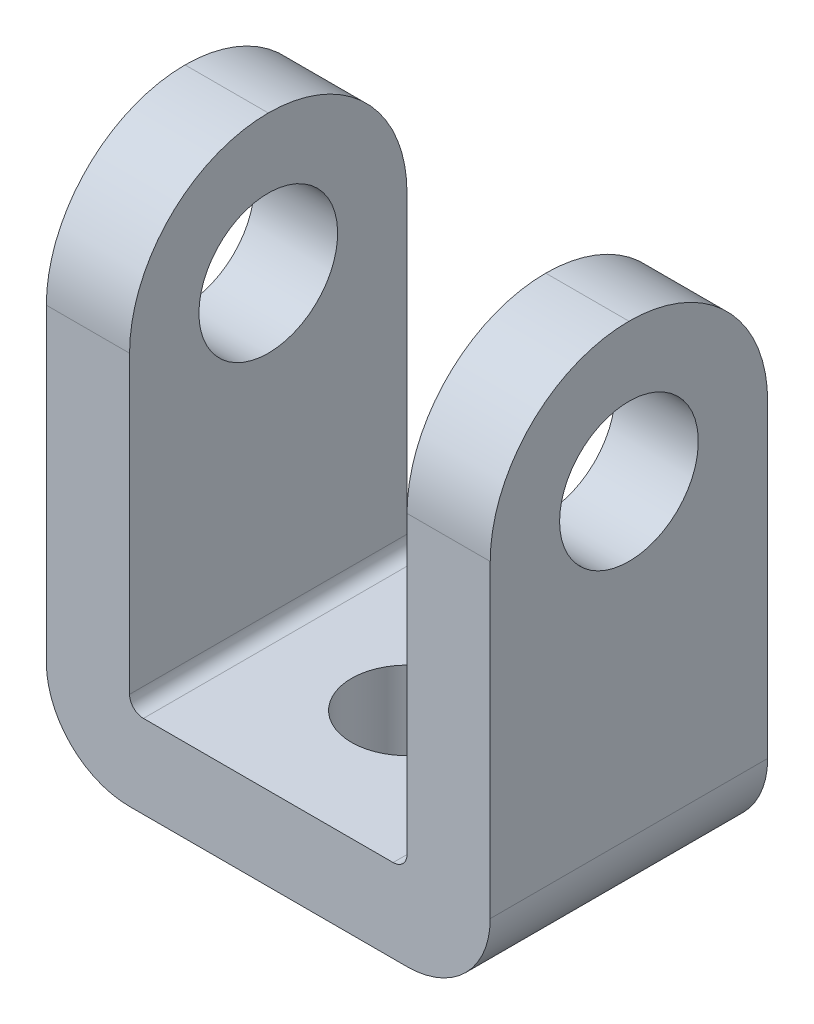
ISO-10303-21;
HEADER;
FILE_DESCRIPTION(('STEP AP214'),'2;1');
FILE_NAME('part.step','',(''),(''),'','','');
FILE_SCHEMA(('AUTOMOTIVE_DESIGN { 1 0 10303 214 1 1 1 1 }'));
ENDSEC;
DATA;
#1=APPLICATION_CONTEXT('core data for automotive mechanical design processes');
#2=APPLICATION_PROTOCOL_DEFINITION('international standard','automotive_design',2000,#1);
#3=PRODUCT_CONTEXT('',#1,'mechanical');
#4=PRODUCT('Part','Part','',(#3));
#5=PRODUCT_RELATED_PRODUCT_CATEGORY('part','',(#4));
#6=PRODUCT_DEFINITION_FORMATION('','',#4);
#7=PRODUCT_DEFINITION_CONTEXT('part definition',#1,'design');
#8=PRODUCT_DEFINITION('design','',#6,#7);
#9=PRODUCT_DEFINITION_SHAPE('','',#8);
#10=(LENGTH_UNIT() NAMED_UNIT(*) SI_UNIT(.MILLI.,.METRE.));
#11=(NAMED_UNIT(*) PLANE_ANGLE_UNIT() SI_UNIT($,.RADIAN.));
#12=(NAMED_UNIT(*) SI_UNIT($,.STERADIAN.) SOLID_ANGLE_UNIT());
#13=UNCERTAINTY_MEASURE_WITH_UNIT(LENGTH_MEASURE(1.E-05),#10,'distance_accuracy_value','');
#14=(GEOMETRIC_REPRESENTATION_CONTEXT(3) GLOBAL_UNCERTAINTY_ASSIGNED_CONTEXT((#13)) GLOBAL_UNIT_ASSIGNED_CONTEXT((#10,
#11,#12)) REPRESENTATION_CONTEXT('',''));
#15=CARTESIAN_POINT('',(0.,0.,0.));
#16=DIRECTION('',(0.,0.,1.));
#17=DIRECTION('',(1.,0.,0.));
#18=AXIS2_PLACEMENT_3D('',#15,#16,#17);
#19=CARTESIAN_POINT('',(0.,0.,10.));
#20=DIRECTION('',(1.,0.,0.));
#21=DIRECTION('',(0.,0.,-1.));
#22=AXIS2_PLACEMENT_3D('',#19,#20,#21);
#23=PLANE('',#22);
#24=CARTESIAN_POINT('',(0.,-5.,5.));
#25=DIRECTION('',(-1.,0.,0.));
#26=DIRECTION('',(0.,0.,1.));
#27=AXIS2_PLACEMENT_3D('',#24,#25,#26);
#28=CIRCLE('',#27,2.5);
#29=CARTESIAN_POINT('',(0.,-5.,7.5));
#30=VERTEX_POINT('',#29);
#31=EDGE_CURVE('E513',#30,#30,#28,.T.);
#32=ORIENTED_EDGE('',*,*,#31,.F.);
#33=EDGE_LOOP('',(#32));
#34=FACE_BOUND('',#33,.T.);
#35=DIRECTION('',(0.,-1.,0.));
#36=VECTOR('',#35,1.);
#37=CARTESIAN_POINT('',(0.,0.,0.));
#38=LINE('',#37,#36);
#39=CARTESIAN_POINT('',(0.,-5.,0.));
#40=VERTEX_POINT('',#39);
#41=CARTESIAN_POINT('',(0.,-16.1484375,0.));
#42=VERTEX_POINT('',#41);
#43=EDGE_CURVE('E262',#40,#42,#38,.T.);
#44=ORIENTED_EDGE('',*,*,#43,.T.);
#45=DIRECTION('',(0.,0.,-1.));
#46=VECTOR('',#45,1.);
#47=CARTESIAN_POINT('',(0.,-16.1484375,10.));
#48=LINE('',#47,#46);
#49=CARTESIAN_POINT('',(0.,-16.1484375,10.));
#50=VERTEX_POINT('',#49);
#51=EDGE_CURVE('E158',#42,#50,#48,.F.);
#52=ORIENTED_EDGE('',*,*,#51,.T.);
#53=DIRECTION('',(0.,-1.,0.));
#54=VECTOR('',#53,1.);
#55=CARTESIAN_POINT('',(0.,0.,10.));
#56=LINE('',#55,#54);
#57=CARTESIAN_POINT('',(0.,-5.,10.));
#58=VERTEX_POINT('',#57);
#59=EDGE_CURVE('E143',#58,#50,#56,.T.);
#60=ORIENTED_EDGE('',*,*,#59,.F.);
#61=CARTESIAN_POINT('',(0.,-5.,5.));
#62=DIRECTION('',(1.,0.,0.));
#63=DIRECTION('',(0.,0.,-1.));
#64=AXIS2_PLACEMENT_3D('',#61,#62,#63);
#65=CIRCLE('',#64,5.);
#66=CARTESIAN_POINT('',(0.,0.,5.));
#67=VERTEX_POINT('',#66);
#68=EDGE_CURVE('E155',#58,#67,#65,.F.);
#69=ORIENTED_EDGE('',*,*,#68,.T.);
#70=CARTESIAN_POINT('',(0.,-5.,5.));
#71=DIRECTION('',(1.,0.,0.));
#72=DIRECTION('',(0.,0.,-1.));
#73=AXIS2_PLACEMENT_3D('',#70,#71,#72);
#74=CIRCLE('',#73,5.);
#75=EDGE_CURVE('E168',#67,#40,#74,.F.);
#76=ORIENTED_EDGE('',*,*,#75,.T.);
#77=EDGE_LOOP('',(#44,#52,#60,#69,#76));
#78=FACE_BOUND('',#77,.T.);
#79=ADVANCED_FACE('F39',(#34,#78),#23,.F.);
#80=CARTESIAN_POINT('',(0.,-19.1484375,10.));
#81=DIRECTION('',(0.,1.,0.));
#82=DIRECTION('',(0.,0.,1.));
#83=AXIS2_PLACEMENT_3D('',#80,#81,#82);
#84=PLANE('',#83);
#85=CARTESIAN_POINT('',(8.,-19.1484375,5.));
#86=DIRECTION('',(0.,1.,0.));
#87=DIRECTION('',(0.,0.,1.));
#88=AXIS2_PLACEMENT_3D('',#85,#86,#87);
#89=CIRCLE('',#88,2.);
#90=CARTESIAN_POINT('',(8.,-19.1484375,7.));
#91=VERTEX_POINT('',#90);
#92=EDGE_CURVE('E511',#91,#91,#89,.F.);
#93=ORIENTED_EDGE('',*,*,#92,.F.);
#94=EDGE_LOOP('',(#93));
#95=FACE_BOUND('',#94,.T.);
#96=DIRECTION('',(1.,0.,0.));
#97=VECTOR('',#96,1.);
#98=CARTESIAN_POINT('',(0.,-19.1484375,0.));
#99=LINE('',#98,#97);
#100=CARTESIAN_POINT('',(3.,-19.1484375,0.));
#101=VERTEX_POINT('',#100);
#102=CARTESIAN_POINT('',(13.,-19.1484375,0.));
#103=VERTEX_POINT('',#102);
#104=EDGE_CURVE('E265',#101,#103,#99,.T.);
#105=ORIENTED_EDGE('',*,*,#104,.T.);
#106=DIRECTION('',(0.,0.,-1.));
#107=VECTOR('',#106,1.);
#108=CARTESIAN_POINT('',(13.,-19.1484375,10.));
#109=LINE('',#108,#107);
#110=CARTESIAN_POINT('',(13.,-19.1484375,10.));
#111=VERTEX_POINT('',#110);
#112=EDGE_CURVE('E206',#103,#111,#109,.F.);
#113=ORIENTED_EDGE('',*,*,#112,.T.);
#114=DIRECTION('',(1.,0.,0.));
#115=VECTOR('',#114,1.);
#116=CARTESIAN_POINT('',(0.,-19.1484375,10.));
#117=LINE('',#116,#115);
#118=CARTESIAN_POINT('',(3.,-19.1484375,10.));
#119=VERTEX_POINT('',#118);
#120=EDGE_CURVE('E160',#119,#111,#117,.T.);
#121=ORIENTED_EDGE('',*,*,#120,.F.);
#122=DIRECTION('',(0.,0.,-1.));
#123=VECTOR('',#122,1.);
#124=CARTESIAN_POINT('',(3.,-19.1484375,10.));
#125=LINE('',#124,#123);
#126=EDGE_CURVE('E202',#119,#101,#125,.T.);
#127=ORIENTED_EDGE('',*,*,#126,.T.);
#128=EDGE_LOOP('',(#105,#113,#121,#127));
#129=FACE_BOUND('',#128,.T.);
#130=ADVANCED_FACE('F309',(#95,#129),#84,.F.);
#131=CARTESIAN_POINT('',(16.,0.,10.));
#132=DIRECTION('',(-1.,0.,0.));
#133=DIRECTION('',(0.,-1.,0.));
#134=AXIS2_PLACEMENT_3D('',#131,#132,#133);
#135=PLANE('',#134);
#136=CARTESIAN_POINT('',(16.,-5.,5.));
#137=DIRECTION('',(-1.,0.,0.));
#138=DIRECTION('',(0.,0.,1.));
#139=AXIS2_PLACEMENT_3D('',#136,#137,#138);
#140=CIRCLE('',#139,2.5);
#141=CARTESIAN_POINT('',(16.,-5.,7.5));
#142=VERTEX_POINT('',#141);
#143=EDGE_CURVE('E281',#142,#142,#140,.T.);
#144=ORIENTED_EDGE('',*,*,#143,.T.);
#145=EDGE_LOOP('',(#144));
#146=FACE_BOUND('',#145,.T.);
#147=DIRECTION('',(0.,1.,0.));
#148=VECTOR('',#147,1.);
#149=CARTESIAN_POINT('',(16.,0.,10.));
#150=LINE('',#149,#148);
#151=CARTESIAN_POINT('',(16.,-16.1484375,10.));
#152=VERTEX_POINT('',#151);
#153=CARTESIAN_POINT('',(16.,-5.,10.));
#154=VERTEX_POINT('',#153);
#155=EDGE_CURVE('E313',#152,#154,#150,.T.);
#156=ORIENTED_EDGE('',*,*,#155,.F.);
#157=DIRECTION('',(0.,0.,-1.));
#158=VECTOR('',#157,1.);
#159=CARTESIAN_POINT('',(16.,-16.1484375,10.));
#160=LINE('',#159,#158);
#161=CARTESIAN_POINT('',(16.,-16.1484375,0.));
#162=VERTEX_POINT('',#161);
#163=EDGE_CURVE('E185',#152,#162,#160,.T.);
#164=ORIENTED_EDGE('',*,*,#163,.T.);
#165=DIRECTION('',(0.,1.,0.));
#166=VECTOR('',#165,1.);
#167=CARTESIAN_POINT('',(16.,0.,0.));
#168=LINE('',#167,#166);
#169=CARTESIAN_POINT('',(16.,-5.,0.));
#170=VERTEX_POINT('',#169);
#171=EDGE_CURVE('E270',#162,#170,#168,.T.);
#172=ORIENTED_EDGE('',*,*,#171,.T.);
#173=CARTESIAN_POINT('',(16.,-5.,5.));
#174=DIRECTION('',(-1.,0.,0.));
#175=DIRECTION('',(0.,-1.,0.));
#176=AXIS2_PLACEMENT_3D('',#173,#174,#175);
#177=CIRCLE('',#176,5.);
#178=CARTESIAN_POINT('',(16.,0.,5.));
#179=VERTEX_POINT('',#178);
#180=EDGE_CURVE('E292',#170,#179,#177,.F.);
#181=ORIENTED_EDGE('',*,*,#180,.T.);
#182=CARTESIAN_POINT('',(16.,-5.,5.));
#183=DIRECTION('',(-1.,0.,0.));
#184=DIRECTION('',(0.,-1.,0.));
#185=AXIS2_PLACEMENT_3D('',#182,#183,#184);
#186=CIRCLE('',#185,5.);
#187=EDGE_CURVE('E295',#179,#154,#186,.F.);
#188=ORIENTED_EDGE('',*,*,#187,.T.);
#189=EDGE_LOOP('',(#156,#164,#172,#181,#188));
#190=FACE_BOUND('',#189,.T.);
#191=ADVANCED_FACE('F340',(#146,#190),#135,.F.);
#192=CARTESIAN_POINT('',(13.,0.,10.));
#193=DIRECTION('',(1.,0.,0.));
#194=DIRECTION('',(0.,1.,0.));
#195=AXIS2_PLACEMENT_3D('',#192,#193,#194);
#196=PLANE('',#195);
#197=CARTESIAN_POINT('',(13.,-5.,5.));
#198=DIRECTION('',(1.,0.,0.));
#199=DIRECTION('',(0.,1.,0.));
#200=AXIS2_PLACEMENT_3D('',#197,#198,#199);
#201=CIRCLE('',#200,2.5);
#202=CARTESIAN_POINT('',(13.,-2.5,5.));
#203=VERTEX_POINT('',#202);
#204=EDGE_CURVE('E266',#203,#203,#201,.T.);
#205=ORIENTED_EDGE('',*,*,#204,.T.);
#206=EDGE_LOOP('',(#205));
#207=FACE_BOUND('',#206,.T.);
#208=DIRECTION('',(0.,-1.,0.));
#209=VECTOR('',#208,1.);
#210=CARTESIAN_POINT('',(13.,0.,0.));
#211=LINE('',#210,#209);
#212=CARTESIAN_POINT('',(13.,-5.,0.));
#213=VERTEX_POINT('',#212);
#214=CARTESIAN_POINT('',(13.,-15.6484375,0.));
#215=VERTEX_POINT('',#214);
#216=EDGE_CURVE('E249',#213,#215,#211,.T.);
#217=ORIENTED_EDGE('',*,*,#216,.T.);
#218=DIRECTION('',(0.,0.,-1.));
#219=VECTOR('',#218,1.);
#220=CARTESIAN_POINT('',(13.,-15.6484375,10.));
#221=LINE('',#220,#219);
#222=CARTESIAN_POINT('',(13.,-15.6484375,10.));
#223=VERTEX_POINT('',#222);
#224=EDGE_CURVE('E224',#215,#223,#221,.F.);
#225=ORIENTED_EDGE('',*,*,#224,.T.);
#226=DIRECTION('',(0.,-1.,0.));
#227=VECTOR('',#226,1.);
#228=CARTESIAN_POINT('',(13.,0.,10.));
#229=LINE('',#228,#227);
#230=CARTESIAN_POINT('',(13.,-5.,10.));
#231=VERTEX_POINT('',#230);
#232=EDGE_CURVE('E258',#231,#223,#229,.T.);
#233=ORIENTED_EDGE('',*,*,#232,.F.);
#234=CARTESIAN_POINT('',(13.,-5.,5.));
#235=DIRECTION('',(1.,0.,0.));
#236=DIRECTION('',(0.,1.,0.));
#237=AXIS2_PLACEMENT_3D('',#234,#235,#236);
#238=CIRCLE('',#237,5.);
#239=CARTESIAN_POINT('',(13.,0.,5.));
#240=VERTEX_POINT('',#239);
#241=EDGE_CURVE('E289',#231,#240,#238,.F.);
#242=ORIENTED_EDGE('',*,*,#241,.T.);
#243=CARTESIAN_POINT('',(13.,-5.,5.));
#244=DIRECTION('',(1.,0.,0.));
#245=DIRECTION('',(0.,1.,0.));
#246=AXIS2_PLACEMENT_3D('',#243,#244,#245);
#247=CIRCLE('',#246,5.);
#248=EDGE_CURVE('E286',#240,#213,#247,.F.);
#249=ORIENTED_EDGE('',*,*,#248,.T.);
#250=EDGE_LOOP('',(#217,#225,#233,#242,#249));
#251=FACE_BOUND('',#250,.T.);
#252=ADVANCED_FACE('F329',(#207,#251),#196,.F.);
#253=CARTESIAN_POINT('',(3.,-16.1484375,10.));
#254=DIRECTION('',(0.,-1.,0.));
#255=DIRECTION('',(0.,0.,-1.));
#256=AXIS2_PLACEMENT_3D('',#253,#254,#255);
#257=PLANE('',#256);
#258=CARTESIAN_POINT('',(8.,-16.1484375,5.));
#259=DIRECTION('',(0.,1.,0.));
#260=DIRECTION('',(0.,0.,1.));
#261=AXIS2_PLACEMENT_3D('',#258,#259,#260);
#262=CIRCLE('',#261,2.);
#263=CARTESIAN_POINT('',(8.,-16.1484375,7.));
#264=VERTEX_POINT('',#263);
#265=EDGE_CURVE('E190',#264,#264,#262,.T.);
#266=ORIENTED_EDGE('',*,*,#265,.F.);
#267=EDGE_LOOP('',(#266));
#268=FACE_BOUND('',#267,.T.);
#269=DIRECTION('',(-1.,0.,0.));
#270=VECTOR('',#269,1.);
#271=CARTESIAN_POINT('',(3.,-16.1484375,10.));
#272=LINE('',#271,#270);
#273=CARTESIAN_POINT('',(12.5,-16.1484375,10.));
#274=VERTEX_POINT('',#273);
#275=CARTESIAN_POINT('',(3.5,-16.1484375,10.));
#276=VERTEX_POINT('',#275);
#277=EDGE_CURVE('E255',#274,#276,#272,.T.);
#278=ORIENTED_EDGE('',*,*,#277,.F.);
#279=DIRECTION('',(0.,0.,-1.));
#280=VECTOR('',#279,1.);
#281=CARTESIAN_POINT('',(12.5,-16.1484375,0.));
#282=LINE('',#281,#280);
#283=CARTESIAN_POINT('',(12.5,-16.1484375,0.));
#284=VERTEX_POINT('',#283);
#285=EDGE_CURVE('E220',#274,#284,#282,.T.);
#286=ORIENTED_EDGE('',*,*,#285,.T.);
#287=DIRECTION('',(-1.,0.,0.));
#288=VECTOR('',#287,1.);
#289=CARTESIAN_POINT('',(3.,-16.1484375,0.));
#290=LINE('',#289,#288);
#291=CARTESIAN_POINT('',(3.5,-16.1484375,0.));
#292=VERTEX_POINT('',#291);
#293=EDGE_CURVE('E242',#284,#292,#290,.T.);
#294=ORIENTED_EDGE('',*,*,#293,.T.);
#295=DIRECTION('',(0.,0.,-1.));
#296=VECTOR('',#295,1.);
#297=CARTESIAN_POINT('',(3.5,-16.1484375,10.));
#298=LINE('',#297,#296);
#299=EDGE_CURVE('E217',#292,#276,#298,.F.);
#300=ORIENTED_EDGE('',*,*,#299,.T.);
#301=EDGE_LOOP('',(#278,#286,#294,#300));
#302=FACE_BOUND('',#301,.T.);
#303=ADVANCED_FACE('F246',(#268,#302),#257,.F.);
#304=CARTESIAN_POINT('',(3.,0.,10.));
#305=DIRECTION('',(-1.,0.,0.));
#306=DIRECTION('',(0.,-1.,0.));
#307=AXIS2_PLACEMENT_3D('',#304,#305,#306);
#308=PLANE('',#307);
#309=CARTESIAN_POINT('',(3.,-5.,5.));
#310=DIRECTION('',(-1.,0.,0.));
#311=DIRECTION('',(0.,-1.,0.));
#312=AXIS2_PLACEMENT_3D('',#309,#310,#311);
#313=CIRCLE('',#312,2.5);
#314=CARTESIAN_POINT('',(3.,-7.5,5.));
#315=VERTEX_POINT('',#314);
#316=EDGE_CURVE('E278',#315,#315,#313,.T.);
#317=ORIENTED_EDGE('',*,*,#316,.T.);
#318=EDGE_LOOP('',(#317));
#319=FACE_BOUND('',#318,.T.);
#320=DIRECTION('',(0.,1.,0.));
#321=VECTOR('',#320,1.);
#322=CARTESIAN_POINT('',(3.,0.,10.));
#323=LINE('',#322,#321);
#324=CARTESIAN_POINT('',(3.,-15.6484375,10.));
#325=VERTEX_POINT('',#324);
#326=CARTESIAN_POINT('',(3.,-5.,10.));
#327=VERTEX_POINT('',#326);
#328=EDGE_CURVE('E145',#325,#327,#323,.T.);
#329=ORIENTED_EDGE('',*,*,#328,.F.);
#330=DIRECTION('',(0.,0.,-1.));
#331=VECTOR('',#330,1.);
#332=CARTESIAN_POINT('',(3.,-15.6484375,0.));
#333=LINE('',#332,#331);
#334=CARTESIAN_POINT('',(3.,-15.6484375,0.));
#335=VERTEX_POINT('',#334);
#336=EDGE_CURVE('E227',#325,#335,#333,.T.);
#337=ORIENTED_EDGE('',*,*,#336,.T.);
#338=DIRECTION('',(0.,1.,0.));
#339=VECTOR('',#338,1.);
#340=CARTESIAN_POINT('',(3.,0.,0.));
#341=LINE('',#340,#339);
#342=CARTESIAN_POINT('',(3.,-5.,0.));
#343=VERTEX_POINT('',#342);
#344=EDGE_CURVE('E161',#335,#343,#341,.T.);
#345=ORIENTED_EDGE('',*,*,#344,.T.);
#346=CARTESIAN_POINT('',(3.,-5.,5.));
#347=DIRECTION('',(-1.,0.,0.));
#348=DIRECTION('',(0.,-1.,0.));
#349=AXIS2_PLACEMENT_3D('',#346,#347,#348);
#350=CIRCLE('',#349,5.);
#351=CARTESIAN_POINT('',(3.,0.,5.));
#352=VERTEX_POINT('',#351);
#353=EDGE_CURVE('E182',#343,#352,#350,.F.);
#354=ORIENTED_EDGE('',*,*,#353,.T.);
#355=CARTESIAN_POINT('',(3.,-5.,5.));
#356=DIRECTION('',(-1.,0.,0.));
#357=DIRECTION('',(0.,-1.,0.));
#358=AXIS2_PLACEMENT_3D('',#355,#356,#357);
#359=CIRCLE('',#358,5.);
#360=EDGE_CURVE('E173',#352,#327,#359,.F.);
#361=ORIENTED_EDGE('',*,*,#360,.T.);
#362=EDGE_LOOP('',(#329,#337,#345,#354,#361));
#363=FACE_BOUND('',#362,.T.);
#364=ADVANCED_FACE('F252',(#319,#363),#308,.F.);
#365=CARTESIAN_POINT('',(0.,0.,10.));
#366=DIRECTION('',(0.,0.,1.));
#367=DIRECTION('',(1.,0.,0.));
#368=AXIS2_PLACEMENT_3D('',#365,#366,#367);
#369=PLANE('',#368);
#370=ORIENTED_EDGE('',*,*,#120,.T.);
#371=CARTESIAN_POINT('',(13.,-16.1484375,10.));
#372=DIRECTION('',(0.,0.,1.));
#373=DIRECTION('',(1.,0.,0.));
#374=AXIS2_PLACEMENT_3D('',#371,#372,#373);
#375=CIRCLE('',#374,3.);
#376=EDGE_CURVE('E212',#111,#152,#375,.T.);
#377=ORIENTED_EDGE('',*,*,#376,.T.);
#378=ORIENTED_EDGE('',*,*,#155,.T.);
#379=DIRECTION('',(-1.,0.,0.));
#380=VECTOR('',#379,1.);
#381=CARTESIAN_POINT('',(13.,-5.,10.));
#382=LINE('',#381,#380);
#383=EDGE_CURVE('E151',#154,#231,#382,.T.);
#384=ORIENTED_EDGE('',*,*,#383,.T.);
#385=ORIENTED_EDGE('',*,*,#232,.T.);
#386=CARTESIAN_POINT('',(12.5,-15.6484375,10.));
#387=DIRECTION('',(0.,0.,1.));
#388=DIRECTION('',(1.,0.,0.));
#389=AXIS2_PLACEMENT_3D('',#386,#387,#388);
#390=CIRCLE('',#389,0.5);
#391=EDGE_CURVE('E233',#223,#274,#390,.F.);
#392=ORIENTED_EDGE('',*,*,#391,.T.);
#393=ORIENTED_EDGE('',*,*,#277,.T.);
#394=CARTESIAN_POINT('',(3.5,-15.6484375,10.));
#395=DIRECTION('',(0.,0.,1.));
#396=DIRECTION('',(1.,0.,0.));
#397=AXIS2_PLACEMENT_3D('',#394,#395,#396);
#398=CIRCLE('',#397,0.5);
#399=EDGE_CURVE('E11',#276,#325,#398,.F.);
#400=ORIENTED_EDGE('',*,*,#399,.T.);
#401=ORIENTED_EDGE('',*,*,#328,.T.);
#402=DIRECTION('',(-1.,0.,0.));
#403=VECTOR('',#402,1.);
#404=CARTESIAN_POINT('',(0.,-5.,10.));
#405=LINE('',#404,#403);
#406=EDGE_CURVE('E139',#327,#58,#405,.T.);
#407=ORIENTED_EDGE('',*,*,#406,.T.);
#408=ORIENTED_EDGE('',*,*,#59,.T.);
#409=CARTESIAN_POINT('',(3.,-16.1484375,10.));
#410=DIRECTION('',(0.,0.,1.));
#411=DIRECTION('',(1.,0.,0.));
#412=AXIS2_PLACEMENT_3D('',#409,#410,#411);
#413=CIRCLE('',#412,3.);
#414=EDGE_CURVE('E209',#50,#119,#413,.T.);
#415=ORIENTED_EDGE('',*,*,#414,.T.);
#416=EDGE_LOOP('',(#370,#377,#378,#384,#385,#392,#393,#400,#401,#407,#408,#415));
#417=FACE_BOUND('',#416,.T.);
#418=ADVANCED_FACE('F142',(#417),#369,.T.);
#419=CARTESIAN_POINT('',(0.,0.,0.));
#420=DIRECTION('',(0.,0.,1.));
#421=DIRECTION('',(1.,0.,0.));
#422=AXIS2_PLACEMENT_3D('',#419,#420,#421);
#423=PLANE('',#422);
#424=ORIENTED_EDGE('',*,*,#171,.F.);
#425=CARTESIAN_POINT('',(13.,-16.1484375,0.));
#426=DIRECTION('',(0.,0.,1.));
#427=DIRECTION('',(1.,0.,0.));
#428=AXIS2_PLACEMENT_3D('',#425,#426,#427);
#429=CIRCLE('',#428,3.);
#430=EDGE_CURVE('E199',#162,#103,#429,.F.);
#431=ORIENTED_EDGE('',*,*,#430,.T.);
#432=ORIENTED_EDGE('',*,*,#104,.F.);
#433=CARTESIAN_POINT('',(3.,-16.1484375,0.));
#434=DIRECTION('',(0.,0.,1.));
#435=DIRECTION('',(1.,0.,0.));
#436=AXIS2_PLACEMENT_3D('',#433,#434,#435);
#437=CIRCLE('',#436,3.);
#438=EDGE_CURVE('E196',#101,#42,#437,.F.);
#439=ORIENTED_EDGE('',*,*,#438,.T.);
#440=ORIENTED_EDGE('',*,*,#43,.F.);
#441=DIRECTION('',(-1.,0.,0.));
#442=VECTOR('',#441,1.);
#443=CARTESIAN_POINT('',(0.,-5.,0.));
#444=LINE('',#443,#442);
#445=EDGE_CURVE('E176',#40,#343,#444,.F.);
#446=ORIENTED_EDGE('',*,*,#445,.T.);
#447=ORIENTED_EDGE('',*,*,#344,.F.);
#448=CARTESIAN_POINT('',(3.5,-15.6484375,0.));
#449=DIRECTION('',(0.,0.,1.));
#450=DIRECTION('',(1.,0.,0.));
#451=AXIS2_PLACEMENT_3D('',#448,#449,#450);
#452=CIRCLE('',#451,0.5);
#453=EDGE_CURVE('E48',#335,#292,#452,.T.);
#454=ORIENTED_EDGE('',*,*,#453,.T.);
#455=ORIENTED_EDGE('',*,*,#293,.F.);
#456=CARTESIAN_POINT('',(12.5,-15.6484375,0.));
#457=DIRECTION('',(0.,0.,1.));
#458=DIRECTION('',(1.,0.,0.));
#459=AXIS2_PLACEMENT_3D('',#456,#457,#458);
#460=CIRCLE('',#459,0.5);
#461=EDGE_CURVE('E230',#284,#215,#460,.T.);
#462=ORIENTED_EDGE('',*,*,#461,.T.);
#463=ORIENTED_EDGE('',*,*,#216,.F.);
#464=DIRECTION('',(-1.,0.,0.));
#465=VECTOR('',#464,1.);
#466=CARTESIAN_POINT('',(0.,-5.,0.));
#467=LINE('',#466,#465);
#468=EDGE_CURVE('E169',#213,#170,#467,.F.);
#469=ORIENTED_EDGE('',*,*,#468,.T.);
#470=EDGE_LOOP('',(#424,#431,#432,#439,#440,#446,#447,#454,#455,#462,#463,#469));
#471=FACE_BOUND('',#470,.T.);
#472=ADVANCED_FACE('F241',(#471),#423,.F.);
#473=CARTESIAN_POINT('',(16.,-5.,5.));
#474=DIRECTION('',(-1.,0.,0.));
#475=DIRECTION('',(0.,0.,1.));
#476=AXIS2_PLACEMENT_3D('',#473,#474,#475);
#477=CYLINDRICAL_SURFACE('',#476,2.5);
#478=ORIENTED_EDGE('',*,*,#31,.T.);
#479=EDGE_LOOP('',(#478));
#480=FACE_BOUND('',#479,.T.);
#481=ORIENTED_EDGE('',*,*,#316,.F.);
#482=EDGE_LOOP('',(#481));
#483=FACE_BOUND('',#482,.T.);
#484=ADVANCED_FACE('F451',(#480,#483),#477,.F.);
#485=ORIENTED_EDGE('',*,*,#143,.F.);
#486=EDGE_LOOP('',(#485));
#487=FACE_BOUND('',#486,.T.);
#488=ORIENTED_EDGE('',*,*,#204,.F.);
#489=EDGE_LOOP('',(#488));
#490=FACE_BOUND('',#489,.T.);
#491=ADVANCED_FACE('F472',(#487,#490),#477,.F.);
#492=CARTESIAN_POINT('',(8.,-19.1494375,5.));
#493=DIRECTION('',(0.,1.,0.));
#494=DIRECTION('',(0.,0.,1.));
#495=AXIS2_PLACEMENT_3D('',#492,#493,#494);
#496=CYLINDRICAL_SURFACE('',#495,2.);
#497=CARTESIAN_POINT('',(8.,-16.1484375,7.));
#498=CARTESIAN_POINT('',(8.,-16.1796875,7.));
#499=CARTESIAN_POINT('',(8.,-16.2109375,7.));
#500=CARTESIAN_POINT('',(8.,-16.2734375,7.));
#501=CARTESIAN_POINT('',(8.,-16.3046875,7.));
#502=CARTESIAN_POINT('',(8.,-16.3671875,7.));
#503=CARTESIAN_POINT('',(8.,-16.3984375,7.));
#504=CARTESIAN_POINT('',(8.,-16.4609375,7.));
#505=CARTESIAN_POINT('',(8.,-16.4921875,7.));
#506=CARTESIAN_POINT('',(8.,-16.5546875,7.));
#507=CARTESIAN_POINT('',(8.,-16.5859375,7.));
#508=CARTESIAN_POINT('',(8.,-16.6484375,7.));
#509=CARTESIAN_POINT('',(8.,-16.6796875,7.));
#510=CARTESIAN_POINT('',(8.,-16.7421875,7.));
#511=CARTESIAN_POINT('',(8.,-16.7734375,7.));
#512=CARTESIAN_POINT('',(8.,-16.8359375,7.));
#513=CARTESIAN_POINT('',(8.,-16.8671875,7.));
#514=CARTESIAN_POINT('',(8.,-16.9296875,7.));
#515=CARTESIAN_POINT('',(8.,-16.9609375,7.));
#516=CARTESIAN_POINT('',(8.,-17.0234375,7.));
#517=CARTESIAN_POINT('',(8.,-17.0546875,7.));
#518=CARTESIAN_POINT('',(8.,-17.1171875,7.));
#519=CARTESIAN_POINT('',(8.,-17.1484375,7.));
#520=CARTESIAN_POINT('',(8.,-17.2109375,7.));
#521=CARTESIAN_POINT('',(8.,-17.2421875,7.));
#522=CARTESIAN_POINT('',(8.,-17.3046875,7.));
#523=CARTESIAN_POINT('',(8.,-17.3359375,7.));
#524=CARTESIAN_POINT('',(8.,-17.3984375,7.));
#525=CARTESIAN_POINT('',(8.,-17.4296875,7.));
#526=CARTESIAN_POINT('',(8.,-17.4921875,7.));
#527=CARTESIAN_POINT('',(8.,-17.5234375,7.));
#528=CARTESIAN_POINT('',(8.,-17.5859375,7.));
#529=CARTESIAN_POINT('',(8.,-17.6171875,7.));
#530=CARTESIAN_POINT('',(8.,-17.6796875,7.));
#531=CARTESIAN_POINT('',(8.,-17.7109375,7.));
#532=CARTESIAN_POINT('',(8.,-17.7734375,7.));
#533=CARTESIAN_POINT('',(8.,-17.8046875,7.));
#534=CARTESIAN_POINT('',(8.,-17.8671875,7.));
#535=CARTESIAN_POINT('',(8.,-17.8984375,7.));
#536=CARTESIAN_POINT('',(8.,-17.9609375,7.));
#537=CARTESIAN_POINT('',(8.,-17.9921875,7.));
#538=CARTESIAN_POINT('',(8.,-18.0546875,7.));
#539=CARTESIAN_POINT('',(8.,-18.0859375,7.));
#540=CARTESIAN_POINT('',(8.,-18.1484375,7.));
#541=CARTESIAN_POINT('',(8.,-18.1796875,7.));
#542=CARTESIAN_POINT('',(8.,-18.2421875,7.));
#543=CARTESIAN_POINT('',(8.,-18.2734375,7.));
#544=CARTESIAN_POINT('',(8.,-18.3359375,7.));
#545=CARTESIAN_POINT('',(8.,-18.3671875,7.));
#546=CARTESIAN_POINT('',(8.,-18.4296875,7.));
#547=CARTESIAN_POINT('',(8.,-18.4609375,7.));
#548=CARTESIAN_POINT('',(8.,-18.5234375,7.));
#549=CARTESIAN_POINT('',(8.,-18.5546875,7.));
#550=CARTESIAN_POINT('',(8.,-18.6171875,7.));
#551=CARTESIAN_POINT('',(8.,-18.6484375,7.));
#552=CARTESIAN_POINT('',(8.,-18.7109375,7.));
#553=CARTESIAN_POINT('',(8.,-18.7421875,7.));
#554=CARTESIAN_POINT('',(8.,-18.8046875,7.));
#555=CARTESIAN_POINT('',(8.,-18.8359375,7.));
#556=CARTESIAN_POINT('',(8.,-18.8984375,7.));
#557=CARTESIAN_POINT('',(8.,-18.9296875,7.));
#558=CARTESIAN_POINT('',(8.,-18.9921875,7.));
#559=CARTESIAN_POINT('',(8.,-19.0234375,7.));
#560=CARTESIAN_POINT('',(8.,-19.0859375,7.));
#561=CARTESIAN_POINT('',(8.,-19.1171875,7.));
#562=CARTESIAN_POINT('',(8.,-19.1484375,7.));
#563=B_SPLINE_CURVE_WITH_KNOTS('',3,(#497,#498,#499,#500,#501,#502,#503,#504,#505,#506,#507,
#508,#509,#510,#511,#512,#513,#514,#515,#516,#517,#518,#519,#520,#521,#522,#523,#524,#525,#526,
#527,#528,#529,#530,#531,#532,#533,#534,#535,#536,#537,#538,#539,#540,#541,#542,#543,#544,#545,
#546,#547,#548,#549,#550,#551,#552,#553,#554,#555,#556,#557,#558,#559,#560,#561,#562),
.UNSPECIFIED.,.F.,.F.,(4,2,2,2,2,2,2,2,2,2,2,2,2,2,2,2,2,2,2,2,2,2,2,2,2,2,2,2,2,2,2,2,4),(0.,
0.0937500000000001,0.1875,0.28125,0.375,0.46875,0.5625,0.656250000000001,0.750000000000001,
0.843750000000001,0.937500000000001,1.03125,1.125,1.21875,1.3125,1.40625,1.5,1.59375,1.6875,
1.78125,1.875,1.96875,2.0625,2.15625,2.25,2.34375,2.4375,2.53125,2.625,2.71875,2.8125,2.90625,
3.),.UNSPECIFIED.);
#564=EDGE_CURVE('BSEAM367',#264,#91,#563,.T.);
#565=ORIENTED_EDGE('',*,*,#265,.T.);
#566=ORIENTED_EDGE('',*,*,#92,.T.);
#567=ORIENTED_EDGE('',*,*,#564,.T.);
#568=ORIENTED_EDGE('',*,*,#564,.F.);
#569=EDGE_LOOP('',(#565,#567,#566,#568));
#570=FACE_BOUND('',#569,.T.);
#571=ADVANCED_FACE('F367',(#570),#496,.F.);
#572=CARTESIAN_POINT('',(13.,-5.,5.));
#573=DIRECTION('',(-1.,0.,0.));
#574=DIRECTION('',(0.,0.,1.));
#575=AXIS2_PLACEMENT_3D('',#572,#573,#574);
#576=CYLINDRICAL_SURFACE('',#575,5.);
#577=DIRECTION('',(-1.,0.,0.));
#578=VECTOR('',#577,1.);
#579=CARTESIAN_POINT('',(13.,0.,5.));
#580=LINE('',#579,#578);
#581=EDGE_CURVE('E186',#179,#240,#580,.T.);
#582=ORIENTED_EDGE('',*,*,#581,.F.);
#583=ORIENTED_EDGE('',*,*,#180,.F.);
#584=ORIENTED_EDGE('',*,*,#468,.F.);
#585=ORIENTED_EDGE('',*,*,#248,.F.);
#586=EDGE_LOOP('',(#582,#583,#584,#585));
#587=FACE_BOUND('',#586,.T.);
#588=ADVANCED_FACE('F333',(#587),#576,.T.);
#589=CARTESIAN_POINT('',(0.,-5.,5.));
#590=DIRECTION('',(1.,0.,0.));
#591=DIRECTION('',(0.,0.,-1.));
#592=AXIS2_PLACEMENT_3D('',#589,#590,#591);
#593=CYLINDRICAL_SURFACE('',#592,5.);
#594=ORIENTED_EDGE('',*,*,#187,.F.);
#595=ORIENTED_EDGE('',*,*,#581,.T.);
#596=ORIENTED_EDGE('',*,*,#241,.F.);
#597=ORIENTED_EDGE('',*,*,#383,.F.);
#598=EDGE_LOOP('',(#594,#595,#596,#597));
#599=FACE_BOUND('',#598,.T.);
#600=ADVANCED_FACE('F337',(#599),#593,.T.);
#601=CARTESIAN_POINT('',(0.,-5.,5.));
#602=DIRECTION('',(1.,0.,0.));
#603=DIRECTION('',(0.,0.,-1.));
#604=AXIS2_PLACEMENT_3D('',#601,#602,#603);
#605=CYLINDRICAL_SURFACE('',#604,5.);
#606=ORIENTED_EDGE('',*,*,#406,.F.);
#607=ORIENTED_EDGE('',*,*,#360,.F.);
#608=DIRECTION('',(-1.,0.,0.));
#609=VECTOR('',#608,1.);
#610=CARTESIAN_POINT('',(3.,0.,5.));
#611=LINE('',#610,#609);
#612=EDGE_CURVE('E165',#67,#352,#611,.F.);
#613=ORIENTED_EDGE('',*,*,#612,.F.);
#614=ORIENTED_EDGE('',*,*,#68,.F.);
#615=EDGE_LOOP('',(#606,#607,#613,#614));
#616=FACE_BOUND('',#615,.T.);
#617=ADVANCED_FACE('F163',(#616),#605,.T.);
#618=CARTESIAN_POINT('',(0.,-5.,5.));
#619=DIRECTION('',(-1.,0.,0.));
#620=DIRECTION('',(0.,0.,1.));
#621=AXIS2_PLACEMENT_3D('',#618,#619,#620);
#622=CYLINDRICAL_SURFACE('',#621,5.);
#623=ORIENTED_EDGE('',*,*,#353,.F.);
#624=ORIENTED_EDGE('',*,*,#445,.F.);
#625=ORIENTED_EDGE('',*,*,#75,.F.);
#626=ORIENTED_EDGE('',*,*,#612,.T.);
#627=EDGE_LOOP('',(#623,#624,#625,#626));
#628=FACE_BOUND('',#627,.T.);
#629=ADVANCED_FACE('F302',(#628),#622,.T.);
#630=CARTESIAN_POINT('',(13.,-16.1484375,10.));
#631=DIRECTION('',(0.,0.,-1.));
#632=DIRECTION('',(-1.,0.,0.));
#633=AXIS2_PLACEMENT_3D('',#630,#631,#632);
#634=CYLINDRICAL_SURFACE('',#633,3.);
#635=ORIENTED_EDGE('',*,*,#376,.F.);
#636=ORIENTED_EDGE('',*,*,#112,.F.);
#637=ORIENTED_EDGE('',*,*,#430,.F.);
#638=ORIENTED_EDGE('',*,*,#163,.F.);
#639=EDGE_LOOP('',(#635,#636,#637,#638));
#640=FACE_BOUND('',#639,.T.);
#641=ADVANCED_FACE('F343',(#640),#634,.T.);
#642=CARTESIAN_POINT('',(3.,-16.1484375,10.));
#643=DIRECTION('',(0.,0.,-1.));
#644=DIRECTION('',(-1.,0.,0.));
#645=AXIS2_PLACEMENT_3D('',#642,#643,#644);
#646=CYLINDRICAL_SURFACE('',#645,3.);
#647=ORIENTED_EDGE('',*,*,#414,.F.);
#648=ORIENTED_EDGE('',*,*,#51,.F.);
#649=ORIENTED_EDGE('',*,*,#438,.F.);
#650=ORIENTED_EDGE('',*,*,#126,.F.);
#651=EDGE_LOOP('',(#647,#648,#649,#650));
#652=FACE_BOUND('',#651,.T.);
#653=ADVANCED_FACE('F304',(#652),#646,.T.);
#654=CARTESIAN_POINT('',(12.5,-15.6484375,10.));
#655=DIRECTION('',(0.,0.,1.));
#656=DIRECTION('',(1.,0.,0.));
#657=AXIS2_PLACEMENT_3D('',#654,#655,#656);
#658=CYLINDRICAL_SURFACE('',#657,0.5);
#659=ORIENTED_EDGE('',*,*,#391,.F.);
#660=ORIENTED_EDGE('',*,*,#224,.F.);
#661=ORIENTED_EDGE('',*,*,#461,.F.);
#662=ORIENTED_EDGE('',*,*,#285,.F.);
#663=EDGE_LOOP('',(#659,#660,#661,#662));
#664=FACE_BOUND('',#663,.T.);
#665=ADVANCED_FACE('F326',(#664),#658,.F.);
#666=CARTESIAN_POINT('',(3.5,-15.6484375,10.));
#667=DIRECTION('',(0.,0.,1.));
#668=DIRECTION('',(1.,0.,0.));
#669=AXIS2_PLACEMENT_3D('',#666,#667,#668);
#670=CYLINDRICAL_SURFACE('',#669,0.5);
#671=ORIENTED_EDGE('',*,*,#399,.F.);
#672=ORIENTED_EDGE('',*,*,#299,.F.);
#673=ORIENTED_EDGE('',*,*,#453,.F.);
#674=ORIENTED_EDGE('',*,*,#336,.F.);
#675=EDGE_LOOP('',(#671,#672,#673,#674));
#676=FACE_BOUND('',#675,.T.);
#677=ADVANCED_FACE('F41',(#676),#670,.F.);
#678=CLOSED_SHELL('',(#79,#130,#191,#252,#303,#364,#418,#472,#484,#491,#571,#588,#600,#617,#629,
#641,#653,#665,#677));
#679=MANIFOLD_SOLID_BREP('B2',#678);
#680=ADVANCED_BREP_SHAPE_REPRESENTATION('',(#18,#679),#14);
#681=SHAPE_DEFINITION_REPRESENTATION(#9,#680);
ENDSEC;
END-ISO-10303-21;
